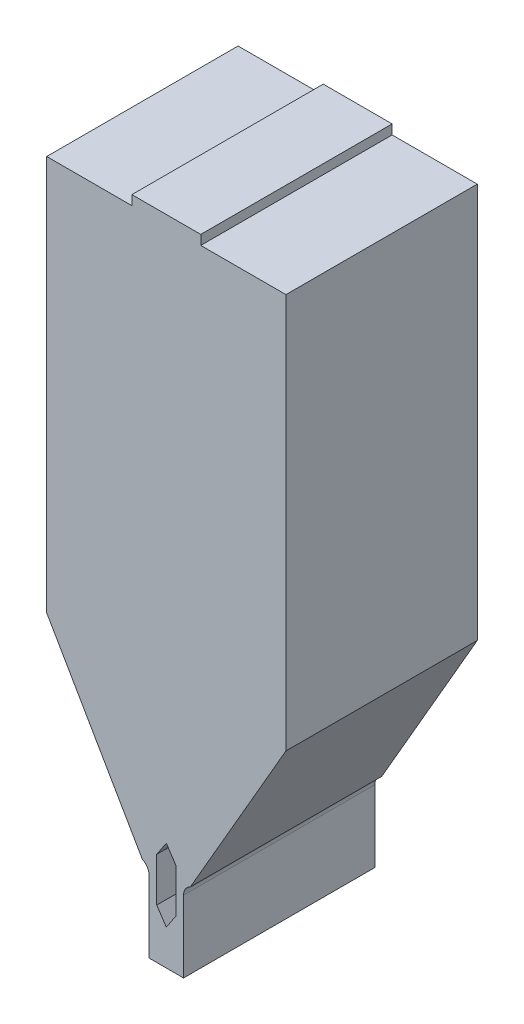
ISO-10303-21;
HEADER;
FILE_DESCRIPTION(('STEP AP214'),'2;1');
FILE_NAME('part.step','',(''),(''),'','','');
FILE_SCHEMA(('AUTOMOTIVE_DESIGN { 1 0 10303 214 1 1 1 1 }'));
ENDSEC;
DATA;
#1=APPLICATION_CONTEXT('core data for automotive mechanical design processes');
#2=APPLICATION_PROTOCOL_DEFINITION('international standard','automotive_design',2000,#1);
#3=PRODUCT_CONTEXT('',#1,'mechanical');
#4=PRODUCT('Part','Part','',(#3));
#5=PRODUCT_RELATED_PRODUCT_CATEGORY('part','',(#4));
#6=PRODUCT_DEFINITION_FORMATION('','',#4);
#7=PRODUCT_DEFINITION_CONTEXT('part definition',#1,'design');
#8=PRODUCT_DEFINITION('design','',#6,#7);
#9=PRODUCT_DEFINITION_SHAPE('','',#8);
#10=(LENGTH_UNIT() NAMED_UNIT(*) SI_UNIT(.MILLI.,.METRE.));
#11=(NAMED_UNIT(*) PLANE_ANGLE_UNIT() SI_UNIT($,.RADIAN.));
#12=(NAMED_UNIT(*) SI_UNIT($,.STERADIAN.) SOLID_ANGLE_UNIT());
#13=UNCERTAINTY_MEASURE_WITH_UNIT(LENGTH_MEASURE(1.E-05),#10,'distance_accuracy_value','');
#14=(GEOMETRIC_REPRESENTATION_CONTEXT(3) GLOBAL_UNCERTAINTY_ASSIGNED_CONTEXT((#13)) GLOBAL_UNIT_ASSIGNED_CONTEXT((#10,
#11,#12)) REPRESENTATION_CONTEXT('',''));
#15=CARTESIAN_POINT('',(0.,0.,0.));
#16=DIRECTION('',(0.,0.,1.));
#17=DIRECTION('',(1.,0.,0.));
#18=AXIS2_PLACEMENT_3D('',#15,#16,#17);
#19=CARTESIAN_POINT('',(125.,597.018363156795,200.));
#20=DIRECTION('',(0.,-1.,0.));
#21=DIRECTION('',(0.,0.,-1.));
#22=AXIS2_PLACEMENT_3D('',#19,#20,#21);
#23=PLANE('',#22);
#24=DIRECTION('',(0.,0.,-1.));
#25=VECTOR('',#24,1.);
#26=CARTESIAN_POINT('',(35.9999999999999,597.018363156795,200.));
#27=LINE('',#26,#25);
#28=CARTESIAN_POINT('',(35.9999999999999,597.018363156795,200.));
#29=VERTEX_POINT('',#28);
#30=CARTESIAN_POINT('',(35.9999999999999,597.018363156795,0.));
#31=VERTEX_POINT('',#30);
#32=EDGE_CURVE('E194',#29,#31,#27,.T.);
#33=ORIENTED_EDGE('',*,*,#32,.F.);
#34=DIRECTION('',(-1.,0.,0.));
#35=VECTOR('',#34,1.);
#36=CARTESIAN_POINT('',(125.,597.018363156795,200.));
#37=LINE('',#36,#35);
#38=CARTESIAN_POINT('',(125.,597.018363156795,200.));
#39=VERTEX_POINT('',#38);
#40=EDGE_CURVE('E215',#39,#29,#37,.T.);
#41=ORIENTED_EDGE('',*,*,#40,.F.);
#42=DIRECTION('',(0.,0.,-1.));
#43=VECTOR('',#42,1.);
#44=CARTESIAN_POINT('',(125.,597.018363156795,200.));
#45=LINE('',#44,#43);
#46=CARTESIAN_POINT('',(125.,597.018363156795,0.));
#47=VERTEX_POINT('',#46);
#48=EDGE_CURVE('E256',#39,#47,#45,.T.);
#49=ORIENTED_EDGE('',*,*,#48,.T.);
#50=DIRECTION('',(-1.,0.,0.));
#51=VECTOR('',#50,1.);
#52=CARTESIAN_POINT('',(125.,597.018363156795,0.));
#53=LINE('',#52,#51);
#54=EDGE_CURVE('E223',#47,#31,#53,.T.);
#55=ORIENTED_EDGE('',*,*,#54,.T.);
#56=EDGE_LOOP('',(#33,#41,#49,#55));
#57=FACE_BOUND('',#56,.T.);
#58=ADVANCED_FACE('F37',(#57),#23,.F.);
#59=CARTESIAN_POINT('',(0.,38.,200.));
#60=DIRECTION('',(0.832050294337844,0.554700196225229,0.));
#61=DIRECTION('',(-0.554700196225229,0.832050294337844,0.));
#62=AXIS2_PLACEMENT_3D('',#59,#60,#61);
#63=PLANE('',#62);
#64=CARTESIAN_POINT('',(0.,38.,100.));
#65=DIRECTION('',(0.832050294337844,0.554700196225229,0.));
#66=DIRECTION('',(0.554700196225229,-0.832050294337844,0.));
#67=AXIS2_PLACEMENT_3D('',#64,#65,#66);
#68=ELLIPSE('',#67,13.52081728299,7.50000000000001);
#69=CARTESIAN_POINT('',(0.,38.,92.5));
#70=VERTEX_POINT('',#69);
#71=CARTESIAN_POINT('',(0.,38.,107.5));
#72=VERTEX_POINT('',#71);
#73=EDGE_CURVE('E11',#70,#72,#68,.F.);
#74=ORIENTED_EDGE('',*,*,#73,.F.);
#75=DIRECTION('',(0.,0.,-1.));
#76=VECTOR('',#75,1.);
#77=CARTESIAN_POINT('',(0.,38.,200.));
#78=LINE('',#77,#76);
#79=CARTESIAN_POINT('',(0.,38.,0.));
#80=VERTEX_POINT('',#79);
#81=EDGE_CURVE('E277',#70,#80,#78,.T.);
#82=ORIENTED_EDGE('',*,*,#81,.T.);
#83=DIRECTION('',(0.554700196225229,-0.832050294337844,0.));
#84=VECTOR('',#83,1.);
#85=CARTESIAN_POINT('',(0.,38.,0.));
#86=LINE('',#85,#84);
#87=CARTESIAN_POINT('',(10.,23.,0.));
#88=VERTEX_POINT('',#87);
#89=EDGE_CURVE('E228',#80,#88,#86,.T.);
#90=ORIENTED_EDGE('',*,*,#89,.T.);
#91=DIRECTION('',(0.,0.,-1.));
#92=VECTOR('',#91,1.);
#93=CARTESIAN_POINT('',(10.,23.,200.));
#94=LINE('',#93,#92);
#95=CARTESIAN_POINT('',(10.,23.,200.));
#96=VERTEX_POINT('',#95);
#97=EDGE_CURVE('E275',#96,#88,#94,.T.);
#98=ORIENTED_EDGE('',*,*,#97,.F.);
#99=DIRECTION('',(0.554700196225229,-0.832050294337844,0.));
#100=VECTOR('',#99,1.);
#101=CARTESIAN_POINT('',(0.,38.,200.));
#102=LINE('',#101,#100);
#103=CARTESIAN_POINT('',(0.,38.,200.));
#104=VERTEX_POINT('',#103);
#105=EDGE_CURVE('E289',#104,#96,#102,.T.);
#106=ORIENTED_EDGE('',*,*,#105,.F.);
#107=EDGE_CURVE('E44',#104,#72,#78,.T.);
#108=ORIENTED_EDGE('',*,*,#107,.T.);
#109=EDGE_LOOP('',(#74,#82,#90,#98,#106,#108));
#110=FACE_BOUND('',#109,.T.);
#111=ADVANCED_FACE('F288',(#110),#63,.F.);
#112=CARTESIAN_POINT('',(10.,-23.,200.));
#113=DIRECTION('',(1.,0.,0.));
#114=DIRECTION('',(0.,1.,0.));
#115=AXIS2_PLACEMENT_3D('',#112,#113,#114);
#116=PLANE('',#115);
#117=DIRECTION('',(0.,-1.,0.));
#118=VECTOR('',#117,1.);
#119=CARTESIAN_POINT('',(10.,-23.,0.));
#120=LINE('',#119,#118);
#121=CARTESIAN_POINT('',(10.,-23.,0.));
#122=VERTEX_POINT('',#121);
#123=EDGE_CURVE('E233',#88,#122,#120,.T.);
#124=ORIENTED_EDGE('',*,*,#123,.T.);
#125=DIRECTION('',(0.,0.,-1.));
#126=VECTOR('',#125,1.);
#127=CARTESIAN_POINT('',(10.,-23.,200.));
#128=LINE('',#127,#126);
#129=CARTESIAN_POINT('',(10.,-23.,200.));
#130=VERTEX_POINT('',#129);
#131=EDGE_CURVE('E273',#130,#122,#128,.T.);
#132=ORIENTED_EDGE('',*,*,#131,.F.);
#133=DIRECTION('',(0.,-1.,0.));
#134=VECTOR('',#133,1.);
#135=CARTESIAN_POINT('',(10.,23.,200.));
#136=LINE('',#135,#134);
#137=EDGE_CURVE('E384',#96,#130,#136,.T.);
#138=ORIENTED_EDGE('',*,*,#137,.F.);
#139=ORIENTED_EDGE('',*,*,#97,.T.);
#140=EDGE_LOOP('',(#124,#132,#138,#139));
#141=FACE_BOUND('',#140,.T.);
#142=ADVANCED_FACE('F385',(#141),#116,.F.);
#143=CARTESIAN_POINT('',(0.,-38.,200.));
#144=DIRECTION('',(0.832050294337844,-0.554700196225229,0.));
#145=DIRECTION('',(0.554700196225229,0.832050294337844,0.));
#146=AXIS2_PLACEMENT_3D('',#143,#144,#145);
#147=PLANE('',#146);
#148=DIRECTION('',(-0.554700196225229,-0.832050294337843,0.));
#149=VECTOR('',#148,1.);
#150=CARTESIAN_POINT('',(0.,-38.,0.));
#151=LINE('',#150,#149);
#152=CARTESIAN_POINT('',(0.,-38.,0.));
#153=VERTEX_POINT('',#152);
#154=EDGE_CURVE('E244',#122,#153,#151,.T.);
#155=ORIENTED_EDGE('',*,*,#154,.T.);
#156=DIRECTION('',(0.,0.,-1.));
#157=VECTOR('',#156,1.);
#158=CARTESIAN_POINT('',(0.,-38.,200.));
#159=LINE('',#158,#157);
#160=CARTESIAN_POINT('',(0.,-38.,200.));
#161=VERTEX_POINT('',#160);
#162=EDGE_CURVE('E270',#161,#153,#159,.T.);
#163=ORIENTED_EDGE('',*,*,#162,.F.);
#164=DIRECTION('',(-0.554700196225229,-0.832050294337843,0.));
#165=VECTOR('',#164,1.);
#166=CARTESIAN_POINT('',(0.,-38.,200.));
#167=LINE('',#166,#165);
#168=EDGE_CURVE('E378',#130,#161,#167,.T.);
#169=ORIENTED_EDGE('',*,*,#168,.F.);
#170=ORIENTED_EDGE('',*,*,#131,.T.);
#171=EDGE_LOOP('',(#155,#163,#169,#170));
#172=FACE_BOUND('',#171,.T.);
#173=ADVANCED_FACE('F435',(#172),#147,.F.);
#174=CARTESIAN_POINT('',(18.,-75.,200.));
#175=DIRECTION('',(0.,1.,0.));
#176=DIRECTION('',(0.,0.,1.));
#177=AXIS2_PLACEMENT_3D('',#174,#175,#176);
#178=PLANE('',#177);
#179=DIRECTION('',(1.,0.,0.));
#180=VECTOR('',#179,1.);
#181=CARTESIAN_POINT('',(18.,-75.,0.));
#182=LINE('',#181,#180);
#183=CARTESIAN_POINT('',(-18.,-75.,0.));
#184=VERTEX_POINT('',#183);
#185=CARTESIAN_POINT('',(18.,-75.,0.));
#186=VERTEX_POINT('',#185);
#187=EDGE_CURVE('E246',#184,#186,#182,.T.);
#188=ORIENTED_EDGE('',*,*,#187,.T.);
#189=DIRECTION('',(0.,0.,-1.));
#190=VECTOR('',#189,1.);
#191=CARTESIAN_POINT('',(18.,-75.,200.));
#192=LINE('',#191,#190);
#193=CARTESIAN_POINT('',(18.,-75.,200.));
#194=VERTEX_POINT('',#193);
#195=EDGE_CURVE('E267',#194,#186,#192,.T.);
#196=ORIENTED_EDGE('',*,*,#195,.F.);
#197=DIRECTION('',(1.,0.,0.));
#198=VECTOR('',#197,1.);
#199=CARTESIAN_POINT('',(18.,-75.,200.));
#200=LINE('',#199,#198);
#201=CARTESIAN_POINT('',(-18.,-75.,200.));
#202=VERTEX_POINT('',#201);
#203=EDGE_CURVE('E387',#202,#194,#200,.T.);
#204=ORIENTED_EDGE('',*,*,#203,.F.);
#205=DIRECTION('',(0.,0.,-1.));
#206=VECTOR('',#205,1.);
#207=CARTESIAN_POINT('',(-18.,-75.,200.));
#208=LINE('',#207,#206);
#209=EDGE_CURVE('E335',#202,#184,#208,.T.);
#210=ORIENTED_EDGE('',*,*,#209,.T.);
#211=EDGE_LOOP('',(#188,#196,#204,#210));
#212=FACE_BOUND('',#211,.T.);
#213=ADVANCED_FACE('F440',(#212),#178,.F.);
#214=CARTESIAN_POINT('',(18.,0.,200.));
#215=DIRECTION('',(-1.,0.,0.));
#216=DIRECTION('',(0.,0.,1.));
#217=AXIS2_PLACEMENT_3D('',#214,#215,#216);
#218=PLANE('',#217);
#219=DIRECTION('',(0.,1.,0.));
#220=VECTOR('',#219,1.);
#221=CARTESIAN_POINT('',(18.,0.,0.));
#222=LINE('',#221,#220);
#223=CARTESIAN_POINT('',(18.,0.,0.));
#224=VERTEX_POINT('',#223);
#225=EDGE_CURVE('E248',#186,#224,#222,.T.);
#226=ORIENTED_EDGE('',*,*,#225,.T.);
#227=DIRECTION('',(0.,0.,-1.));
#228=VECTOR('',#227,1.);
#229=CARTESIAN_POINT('',(18.,0.,200.));
#230=LINE('',#229,#228);
#231=CARTESIAN_POINT('',(18.,0.,200.));
#232=VERTEX_POINT('',#231);
#233=EDGE_CURVE('E264',#232,#224,#230,.T.);
#234=ORIENTED_EDGE('',*,*,#233,.F.);
#235=DIRECTION('',(0.,1.,0.));
#236=VECTOR('',#235,1.);
#237=CARTESIAN_POINT('',(18.,0.,200.));
#238=LINE('',#237,#236);
#239=EDGE_CURVE('E391',#194,#232,#238,.T.);
#240=ORIENTED_EDGE('',*,*,#239,.F.);
#241=ORIENTED_EDGE('',*,*,#195,.T.);
#242=EDGE_LOOP('',(#226,#234,#240,#241));
#243=FACE_BOUND('',#242,.T.);
#244=ADVANCED_FACE('F444',(#243),#218,.F.);
#245=CARTESIAN_POINT('',(30.,0.,200.));
#246=DIRECTION('',(0.,0.,-1.));
#247=DIRECTION('',(-1.,0.,0.));
#248=AXIS2_PLACEMENT_3D('',#245,#246,#247);
#249=CYLINDRICAL_SURFACE('',#248,12.);
#250=CARTESIAN_POINT('',(30.,0.,0.));
#251=DIRECTION('',(0.,0.,-1.));
#252=DIRECTION('',(-1.,0.,0.));
#253=AXIS2_PLACEMENT_3D('',#250,#251,#252);
#254=CIRCLE('',#253,12.);
#255=CARTESIAN_POINT('',(25.1,10.9539947051293,0.));
#256=VERTEX_POINT('',#255);
#257=EDGE_CURVE('E250',#224,#256,#254,.T.);
#258=ORIENTED_EDGE('',*,*,#257,.T.);
#259=DIRECTION('',(0.,0.,-1.));
#260=VECTOR('',#259,1.);
#261=CARTESIAN_POINT('',(25.1,10.9539947051293,200.));
#262=LINE('',#261,#260);
#263=CARTESIAN_POINT('',(25.1,10.9539947051293,200.));
#264=VERTEX_POINT('',#263);
#265=EDGE_CURVE('E261',#264,#256,#262,.T.);
#266=ORIENTED_EDGE('',*,*,#265,.F.);
#267=CARTESIAN_POINT('',(30.,0.,200.));
#268=DIRECTION('',(0.,0.,-1.));
#269=DIRECTION('',(-1.,0.,0.));
#270=AXIS2_PLACEMENT_3D('',#267,#268,#269);
#271=CIRCLE('',#270,12.);
#272=EDGE_CURVE('E393',#232,#264,#271,.T.);
#273=ORIENTED_EDGE('',*,*,#272,.F.);
#274=ORIENTED_EDGE('',*,*,#233,.T.);
#275=EDGE_LOOP('',(#258,#266,#273,#274));
#276=FACE_BOUND('',#275,.T.);
#277=ADVANCED_FACE('F448',(#276),#249,.F.);
#278=CARTESIAN_POINT('',(25.1,10.9539947051293,200.));
#279=DIRECTION('',(-0.866025403784442,0.499999999999995,0.));
#280=DIRECTION('',(-0.499999999999995,-0.866025403784442,0.));
#281=AXIS2_PLACEMENT_3D('',#278,#279,#280);
#282=PLANE('',#281);
#283=DIRECTION('',(0.499999999999995,0.866025403784442,0.));
#284=VECTOR('',#283,1.);
#285=CARTESIAN_POINT('',(25.1,10.9539947051293,0.));
#286=LINE('',#285,#284);
#287=CARTESIAN_POINT('',(125.,183.985870381263,0.));
#288=VERTEX_POINT('',#287);
#289=EDGE_CURVE('E252',#256,#288,#286,.T.);
#290=ORIENTED_EDGE('',*,*,#289,.T.);
#291=DIRECTION('',(0.,0.,-1.));
#292=VECTOR('',#291,1.);
#293=CARTESIAN_POINT('',(125.,183.985870381263,200.));
#294=LINE('',#293,#292);
#295=CARTESIAN_POINT('',(125.,183.985870381263,200.));
#296=VERTEX_POINT('',#295);
#297=EDGE_CURVE('E258',#296,#288,#294,.T.);
#298=ORIENTED_EDGE('',*,*,#297,.F.);
#299=DIRECTION('',(0.499999999999995,0.866025403784442,0.));
#300=VECTOR('',#299,1.);
#301=CARTESIAN_POINT('',(25.1,10.9539947051293,200.));
#302=LINE('',#301,#300);
#303=EDGE_CURVE('E394',#264,#296,#302,.T.);
#304=ORIENTED_EDGE('',*,*,#303,.F.);
#305=ORIENTED_EDGE('',*,*,#265,.T.);
#306=EDGE_LOOP('',(#290,#298,#304,#305));
#307=FACE_BOUND('',#306,.T.);
#308=ADVANCED_FACE('F452',(#307),#282,.F.);
#309=CARTESIAN_POINT('',(125.,183.985870381263,200.));
#310=DIRECTION('',(-1.,0.,0.));
#311=DIRECTION('',(0.,0.,1.));
#312=AXIS2_PLACEMENT_3D('',#309,#310,#311);
#313=PLANE('',#312);
#314=DIRECTION('',(0.,1.,0.));
#315=VECTOR('',#314,1.);
#316=CARTESIAN_POINT('',(125.,183.985870381263,0.));
#317=LINE('',#316,#315);
#318=EDGE_CURVE('E254',#288,#47,#317,.T.);
#319=ORIENTED_EDGE('',*,*,#318,.T.);
#320=ORIENTED_EDGE('',*,*,#48,.F.);
#321=DIRECTION('',(0.,1.,0.));
#322=VECTOR('',#321,1.);
#323=CARTESIAN_POINT('',(125.,183.985870381263,200.));
#324=LINE('',#323,#322);
#325=EDGE_CURVE('E240',#296,#39,#324,.T.);
#326=ORIENTED_EDGE('',*,*,#325,.F.);
#327=ORIENTED_EDGE('',*,*,#297,.T.);
#328=EDGE_LOOP('',(#319,#320,#326,#327));
#329=FACE_BOUND('',#328,.T.);
#330=ADVANCED_FACE('F402',(#329),#313,.F.);
#331=CARTESIAN_POINT('',(30.,0.,200.));
#332=DIRECTION('',(0.,0.,-1.));
#333=DIRECTION('',(-1.,0.,0.));
#334=AXIS2_PLACEMENT_3D('',#331,#332,#333);
#335=PLANE('',#334);
#336=DIRECTION('',(0.,1.,0.));
#337=VECTOR('',#336,1.);
#338=CARTESIAN_POINT('',(-18.,0.,200.));
#339=LINE('',#338,#337);
#340=CARTESIAN_POINT('',(-18.,0.,200.));
#341=VERTEX_POINT('',#340);
#342=EDGE_CURVE('E367',#202,#341,#339,.T.);
#343=ORIENTED_EDGE('',*,*,#342,.F.);
#344=ORIENTED_EDGE('',*,*,#203,.T.);
#345=ORIENTED_EDGE('',*,*,#239,.T.);
#346=ORIENTED_EDGE('',*,*,#272,.T.);
#347=ORIENTED_EDGE('',*,*,#303,.T.);
#348=ORIENTED_EDGE('',*,*,#325,.T.);
#349=ORIENTED_EDGE('',*,*,#40,.T.);
#350=DIRECTION('',(0.,-1.,0.));
#351=VECTOR('',#350,1.);
#352=CARTESIAN_POINT('',(35.9999999999999,607.018363156795,200.));
#353=LINE('',#352,#351);
#354=CARTESIAN_POINT('',(35.9999999999999,607.018363156795,200.));
#355=VERTEX_POINT('',#354);
#356=EDGE_CURVE('E219',#355,#29,#353,.T.);
#357=ORIENTED_EDGE('',*,*,#356,.F.);
#358=DIRECTION('',(1.,0.,0.));
#359=VECTOR('',#358,1.);
#360=CARTESIAN_POINT('',(-1.42227759985557E-13,607.018363156795,200.));
#361=LINE('',#360,#359);
#362=CARTESIAN_POINT('',(-35.9999999999999,607.018363156795,200.));
#363=VERTEX_POINT('',#362);
#364=EDGE_CURVE('E200',#363,#355,#361,.T.);
#365=ORIENTED_EDGE('',*,*,#364,.F.);
#366=DIRECTION('',(0.,-1.,0.));
#367=VECTOR('',#366,1.);
#368=CARTESIAN_POINT('',(-35.9999999999999,607.018363156795,200.));
#369=LINE('',#368,#367);
#370=CARTESIAN_POINT('',(-35.9999999999999,597.018363156795,200.));
#371=VERTEX_POINT('',#370);
#372=EDGE_CURVE('E414',#363,#371,#369,.T.);
#373=ORIENTED_EDGE('',*,*,#372,.T.);
#374=DIRECTION('',(1.,0.,0.));
#375=VECTOR('',#374,1.);
#376=CARTESIAN_POINT('',(-125.,597.018363156795,200.));
#377=LINE('',#376,#375);
#378=CARTESIAN_POINT('',(-125.,597.018363156795,200.));
#379=VERTEX_POINT('',#378);
#380=EDGE_CURVE('E51',#379,#371,#377,.T.);
#381=ORIENTED_EDGE('',*,*,#380,.F.);
#382=DIRECTION('',(0.,1.,0.));
#383=VECTOR('',#382,1.);
#384=CARTESIAN_POINT('',(-125.,183.985870381263,200.));
#385=LINE('',#384,#383);
#386=CARTESIAN_POINT('',(-125.,183.985870381263,200.));
#387=VERTEX_POINT('',#386);
#388=EDGE_CURVE('E365',#387,#379,#385,.T.);
#389=ORIENTED_EDGE('',*,*,#388,.F.);
#390=DIRECTION('',(-0.499999999999995,0.866025403784442,0.));
#391=VECTOR('',#390,1.);
#392=CARTESIAN_POINT('',(-25.1,10.9539947051293,200.));
#393=LINE('',#392,#391);
#394=CARTESIAN_POINT('',(-25.1,10.9539947051293,200.));
#395=VERTEX_POINT('',#394);
#396=EDGE_CURVE('E347',#395,#387,#393,.T.);
#397=ORIENTED_EDGE('',*,*,#396,.F.);
#398=CARTESIAN_POINT('',(-30.,0.,200.));
#399=DIRECTION('',(0.,0.,1.));
#400=DIRECTION('',(1.,0.,0.));
#401=AXIS2_PLACEMENT_3D('',#398,#399,#400);
#402=CIRCLE('',#401,12.);
#403=EDGE_CURVE('E361',#341,#395,#402,.T.);
#404=ORIENTED_EDGE('',*,*,#403,.F.);
#405=EDGE_LOOP('',(#343,#344,#345,#346,#347,#348,#349,#357,#365,#373,#381,#389,#397,#404));
#406=FACE_BOUND('',#405,.T.);
#407=ORIENTED_EDGE('',*,*,#168,.T.);
#408=DIRECTION('',(0.554700196225229,-0.832050294337843,0.));
#409=VECTOR('',#408,1.);
#410=CARTESIAN_POINT('',(0.,-38.,200.));
#411=LINE('',#410,#409);
#412=CARTESIAN_POINT('',(-10.,-23.,200.));
#413=VERTEX_POINT('',#412);
#414=EDGE_CURVE('E306',#413,#161,#411,.T.);
#415=ORIENTED_EDGE('',*,*,#414,.F.);
#416=DIRECTION('',(0.,-1.,0.));
#417=VECTOR('',#416,1.);
#418=CARTESIAN_POINT('',(-10.,-23.,200.));
#419=LINE('',#418,#417);
#420=CARTESIAN_POINT('',(-10.,23.,200.));
#421=VERTEX_POINT('',#420);
#422=EDGE_CURVE('E300',#421,#413,#419,.T.);
#423=ORIENTED_EDGE('',*,*,#422,.F.);
#424=DIRECTION('',(-0.554700196225229,-0.832050294337844,0.));
#425=VECTOR('',#424,1.);
#426=CARTESIAN_POINT('',(0.,38.,200.));
#427=LINE('',#426,#425);
#428=EDGE_CURVE('E294',#104,#421,#427,.T.);
#429=ORIENTED_EDGE('',*,*,#428,.F.);
#430=ORIENTED_EDGE('',*,*,#105,.T.);
#431=ORIENTED_EDGE('',*,*,#137,.T.);
#432=EDGE_LOOP('',(#407,#415,#423,#429,#430,#431));
#433=FACE_BOUND('',#432,.T.);
#434=ADVANCED_FACE('F297',(#406,#433),#335,.F.);
#435=CARTESIAN_POINT('',(30.,0.,0.));
#436=DIRECTION('',(0.,0.,-1.));
#437=DIRECTION('',(-1.,0.,0.));
#438=AXIS2_PLACEMENT_3D('',#435,#436,#437);
#439=PLANE('',#438);
#440=ORIENTED_EDGE('',*,*,#187,.F.);
#441=DIRECTION('',(0.,1.,0.));
#442=VECTOR('',#441,1.);
#443=CARTESIAN_POINT('',(-18.,0.,0.));
#444=LINE('',#443,#442);
#445=CARTESIAN_POINT('',(-18.,0.,0.));
#446=VERTEX_POINT('',#445);
#447=EDGE_CURVE('E322',#184,#446,#444,.T.);
#448=ORIENTED_EDGE('',*,*,#447,.T.);
#449=CARTESIAN_POINT('',(-30.,0.,0.));
#450=DIRECTION('',(0.,0.,1.));
#451=DIRECTION('',(1.,0.,0.));
#452=AXIS2_PLACEMENT_3D('',#449,#450,#451);
#453=CIRCLE('',#452,12.);
#454=CARTESIAN_POINT('',(-25.1,10.9539947051293,0.));
#455=VERTEX_POINT('',#454);
#456=EDGE_CURVE('E319',#446,#455,#453,.T.);
#457=ORIENTED_EDGE('',*,*,#456,.T.);
#458=DIRECTION('',(-0.499999999999995,0.866025403784442,0.));
#459=VECTOR('',#458,1.);
#460=CARTESIAN_POINT('',(-25.1,10.9539947051293,0.));
#461=LINE('',#460,#459);
#462=CARTESIAN_POINT('',(-125.,183.985870381263,0.));
#463=VERTEX_POINT('',#462);
#464=EDGE_CURVE('E316',#455,#463,#461,.T.);
#465=ORIENTED_EDGE('',*,*,#464,.T.);
#466=DIRECTION('',(0.,1.,0.));
#467=VECTOR('',#466,1.);
#468=CARTESIAN_POINT('',(-125.,183.985870381263,0.));
#469=LINE('',#468,#467);
#470=CARTESIAN_POINT('',(-125.,597.018363156795,0.));
#471=VERTEX_POINT('',#470);
#472=EDGE_CURVE('E312',#463,#471,#469,.T.);
#473=ORIENTED_EDGE('',*,*,#472,.T.);
#474=DIRECTION('',(1.,0.,0.));
#475=VECTOR('',#474,1.);
#476=CARTESIAN_POINT('',(-125.,597.018363156795,0.));
#477=LINE('',#476,#475);
#478=CARTESIAN_POINT('',(-35.9999999999999,597.018363156795,0.));
#479=VERTEX_POINT('',#478);
#480=EDGE_CURVE('E310',#471,#479,#477,.T.);
#481=ORIENTED_EDGE('',*,*,#480,.T.);
#482=DIRECTION('',(0.,-1.,0.));
#483=VECTOR('',#482,1.);
#484=CARTESIAN_POINT('',(-35.9999999999999,607.018363156795,0.));
#485=LINE('',#484,#483);
#486=CARTESIAN_POINT('',(-35.9999999999999,607.018363156795,0.));
#487=VERTEX_POINT('',#486);
#488=EDGE_CURVE('E313',#487,#479,#485,.T.);
#489=ORIENTED_EDGE('',*,*,#488,.F.);
#490=DIRECTION('',(-1.,0.,0.));
#491=VECTOR('',#490,1.);
#492=CARTESIAN_POINT('',(0.,607.018363156795,0.));
#493=LINE('',#492,#491);
#494=CARTESIAN_POINT('',(35.9999999999999,607.018363156795,0.));
#495=VERTEX_POINT('',#494);
#496=EDGE_CURVE('E204',#495,#487,#493,.T.);
#497=ORIENTED_EDGE('',*,*,#496,.F.);
#498=DIRECTION('',(0.,-1.,0.));
#499=VECTOR('',#498,1.);
#500=CARTESIAN_POINT('',(35.9999999999999,607.018363156795,0.));
#501=LINE('',#500,#499);
#502=EDGE_CURVE('E206',#495,#31,#501,.T.);
#503=ORIENTED_EDGE('',*,*,#502,.T.);
#504=ORIENTED_EDGE('',*,*,#54,.F.);
#505=ORIENTED_EDGE('',*,*,#318,.F.);
#506=ORIENTED_EDGE('',*,*,#289,.F.);
#507=ORIENTED_EDGE('',*,*,#257,.F.);
#508=ORIENTED_EDGE('',*,*,#225,.F.);
#509=EDGE_LOOP('',(#440,#448,#457,#465,#473,#481,#489,#497,#503,#504,#505,#506,#507,#508));
#510=FACE_BOUND('',#509,.T.);
#511=DIRECTION('',(0.554700196225229,-0.832050294337843,0.));
#512=VECTOR('',#511,1.);
#513=CARTESIAN_POINT('',(0.,-38.,0.));
#514=LINE('',#513,#512);
#515=CARTESIAN_POINT('',(-10.,-23.,0.));
#516=VERTEX_POINT('',#515);
#517=EDGE_CURVE('E325',#516,#153,#514,.T.);
#518=ORIENTED_EDGE('',*,*,#517,.T.);
#519=ORIENTED_EDGE('',*,*,#154,.F.);
#520=ORIENTED_EDGE('',*,*,#123,.F.);
#521=ORIENTED_EDGE('',*,*,#89,.F.);
#522=DIRECTION('',(-0.554700196225229,-0.832050294337844,0.));
#523=VECTOR('',#522,1.);
#524=CARTESIAN_POINT('',(0.,38.,0.));
#525=LINE('',#524,#523);
#526=CARTESIAN_POINT('',(-10.,23.,0.));
#527=VERTEX_POINT('',#526);
#528=EDGE_CURVE('E330',#80,#527,#525,.T.);
#529=ORIENTED_EDGE('',*,*,#528,.T.);
#530=DIRECTION('',(0.,-1.,0.));
#531=VECTOR('',#530,1.);
#532=CARTESIAN_POINT('',(-10.,23.,0.));
#533=LINE('',#532,#531);
#534=EDGE_CURVE('E328',#527,#516,#533,.T.);
#535=ORIENTED_EDGE('',*,*,#534,.T.);
#536=EDGE_LOOP('',(#518,#519,#520,#521,#529,#535));
#537=FACE_BOUND('',#536,.T.);
#538=ADVANCED_FACE('F353',(#510,#537),#439,.T.);
#539=CARTESIAN_POINT('',(35.9999999999999,607.018363156795,200.));
#540=DIRECTION('',(-1.,0.,0.));
#541=DIRECTION('',(0.,0.,1.));
#542=AXIS2_PLACEMENT_3D('',#539,#540,#541);
#543=PLANE('',#542);
#544=ORIENTED_EDGE('',*,*,#32,.T.);
#545=ORIENTED_EDGE('',*,*,#502,.F.);
#546=DIRECTION('',(0.,0.,-1.));
#547=VECTOR('',#546,1.);
#548=CARTESIAN_POINT('',(35.9999999999999,607.018363156795,200.));
#549=LINE('',#548,#547);
#550=EDGE_CURVE('E202',#355,#495,#549,.T.);
#551=ORIENTED_EDGE('',*,*,#550,.F.);
#552=ORIENTED_EDGE('',*,*,#356,.T.);
#553=EDGE_LOOP('',(#544,#545,#551,#552));
#554=FACE_BOUND('',#553,.T.);
#555=ADVANCED_FACE('F405',(#554),#543,.F.);
#556=CARTESIAN_POINT('',(0.,607.018363156795,0.));
#557=DIRECTION('',(0.,-1.,0.));
#558=DIRECTION('',(0.,0.,-1.));
#559=AXIS2_PLACEMENT_3D('',#556,#557,#558);
#560=PLANE('',#559);
#561=ORIENTED_EDGE('',*,*,#496,.T.);
#562=DIRECTION('',(0.,0.,-1.));
#563=VECTOR('',#562,1.);
#564=CARTESIAN_POINT('',(-35.9999999999999,607.018363156795,200.));
#565=LINE('',#564,#563);
#566=EDGE_CURVE('E412',#363,#487,#565,.T.);
#567=ORIENTED_EDGE('',*,*,#566,.F.);
#568=ORIENTED_EDGE('',*,*,#364,.T.);
#569=ORIENTED_EDGE('',*,*,#550,.T.);
#570=EDGE_LOOP('',(#561,#567,#568,#569));
#571=FACE_BOUND('',#570,.T.);
#572=ADVANCED_FACE('F184',(#571),#560,.F.);
#573=CARTESIAN_POINT('',(0.,74.8867513459482,100.));
#574=DIRECTION('',(0.,-1.,0.));
#575=DIRECTION('',(0.,0.,-1.));
#576=AXIS2_PLACEMENT_3D('',#573,#574,#575);
#577=CONICAL_SURFACE('',#576,0.,1.04719755119659);
#578=CARTESIAN_POINT('',(0.,74.8867513459482,100.));
#579=VERTEX_POINT('',#578);
#580=VERTEX_LOOP('',#579);
#581=FACE_BOUND('',#580,.T.);
#582=CARTESIAN_POINT('',(0.,72.,100.));
#583=DIRECTION('',(0.,-1.,0.));
#584=DIRECTION('',(0.,0.,-1.));
#585=AXIS2_PLACEMENT_3D('',#582,#583,#584);
#586=CIRCLE('',#585,5.);
#587=CARTESIAN_POINT('',(0.,72.,95.));
#588=VERTEX_POINT('',#587);
#589=EDGE_CURVE('E188',#588,#588,#586,.T.);
#590=ORIENTED_EDGE('',*,*,#589,.T.);
#591=EDGE_LOOP('',(#590));
#592=FACE_BOUND('',#591,.T.);
#593=ADVANCED_FACE('F180',(#581,#592),#577,.F.);
#594=CARTESIAN_POINT('',(0.,72.,100.));
#595=DIRECTION('',(0.,-1.,0.));
#596=DIRECTION('',(0.,0.,-1.));
#597=AXIS2_PLACEMENT_3D('',#594,#595,#596);
#598=CONICAL_SURFACE('',#597,5.,0.785398163397448);
#599=ORIENTED_EDGE('',*,*,#589,.F.);
#600=EDGE_LOOP('',(#599));
#601=FACE_BOUND('',#600,.T.);
#602=CARTESIAN_POINT('',(0.,69.5,100.));
#603=DIRECTION('',(0.,-1.,0.));
#604=DIRECTION('',(0.,0.,-1.));
#605=AXIS2_PLACEMENT_3D('',#602,#603,#604);
#606=CIRCLE('',#605,7.50000000000001);
#607=CARTESIAN_POINT('',(0.,69.5,92.5));
#608=VERTEX_POINT('',#607);
#609=EDGE_CURVE('E190',#608,#608,#606,.T.);
#610=ORIENTED_EDGE('',*,*,#609,.T.);
#611=EDGE_LOOP('',(#610));
#612=FACE_BOUND('',#611,.T.);
#613=ADVANCED_FACE('F183',(#601,#612),#598,.F.);
#614=CARTESIAN_POINT('',(0.,0.,100.));
#615=DIRECTION('',(0.,-1.,0.));
#616=DIRECTION('',(0.,0.,-1.));
#617=AXIS2_PLACEMENT_3D('',#614,#615,#616);
#618=CYLINDRICAL_SURFACE('',#617,7.50000000000001);
#619=ORIENTED_EDGE('',*,*,#609,.F.);
#620=EDGE_LOOP('',(#619));
#621=FACE_BOUND('',#620,.T.);
#622=ORIENTED_EDGE('',*,*,#73,.T.);
#623=CARTESIAN_POINT('',(0.,38.,100.));
#624=DIRECTION('',(0.832050294337844,-0.554700196225229,0.));
#625=DIRECTION('',(-0.554700196225229,-0.832050294337844,0.));
#626=AXIS2_PLACEMENT_3D('',#623,#624,#625);
#627=ELLIPSE('',#626,13.52081728299,7.50000000000001);
#628=EDGE_CURVE('E295',#70,#72,#627,.F.);
#629=ORIENTED_EDGE('',*,*,#628,.F.);
#630=EDGE_LOOP('',(#622,#629));
#631=FACE_BOUND('',#630,.T.);
#632=ADVANCED_FACE('F467',(#621,#631),#618,.F.);
#633=CARTESIAN_POINT('',(-125.,597.018363156795,200.));
#634=DIRECTION('',(0.,1.,0.));
#635=DIRECTION('',(0.,0.,1.));
#636=AXIS2_PLACEMENT_3D('',#633,#634,#635);
#637=PLANE('',#636);
#638=DIRECTION('',(0.,0.,-1.));
#639=VECTOR('',#638,1.);
#640=CARTESIAN_POINT('',(-35.9999999999999,597.018363156795,200.));
#641=LINE('',#640,#639);
#642=EDGE_CURVE('E56',#371,#479,#641,.T.);
#643=ORIENTED_EDGE('',*,*,#642,.T.);
#644=ORIENTED_EDGE('',*,*,#480,.F.);
#645=DIRECTION('',(0.,0.,-1.));
#646=VECTOR('',#645,1.);
#647=CARTESIAN_POINT('',(-125.,597.018363156795,200.));
#648=LINE('',#647,#646);
#649=EDGE_CURVE('E191',#379,#471,#648,.T.);
#650=ORIENTED_EDGE('',*,*,#649,.F.);
#651=ORIENTED_EDGE('',*,*,#380,.T.);
#652=EDGE_LOOP('',(#643,#644,#650,#651));
#653=FACE_BOUND('',#652,.T.);
#654=ADVANCED_FACE('F470',(#653),#637,.T.);
#655=CARTESIAN_POINT('',(-125.,183.985870381263,200.));
#656=DIRECTION('',(-1.,0.,0.));
#657=DIRECTION('',(0.,0.,1.));
#658=AXIS2_PLACEMENT_3D('',#655,#656,#657);
#659=PLANE('',#658);
#660=ORIENTED_EDGE('',*,*,#472,.F.);
#661=DIRECTION('',(0.,0.,-1.));
#662=VECTOR('',#661,1.);
#663=CARTESIAN_POINT('',(-125.,183.985870381263,200.));
#664=LINE('',#663,#662);
#665=EDGE_CURVE('E196',#387,#463,#664,.T.);
#666=ORIENTED_EDGE('',*,*,#665,.F.);
#667=ORIENTED_EDGE('',*,*,#388,.T.);
#668=ORIENTED_EDGE('',*,*,#649,.T.);
#669=EDGE_LOOP('',(#660,#666,#667,#668));
#670=FACE_BOUND('',#669,.T.);
#671=ADVANCED_FACE('F351',(#670),#659,.T.);
#672=CARTESIAN_POINT('',(-25.1,10.9539947051293,200.));
#673=DIRECTION('',(-0.866025403784442,-0.499999999999995,0.));
#674=DIRECTION('',(0.499999999999995,-0.866025403784442,0.));
#675=AXIS2_PLACEMENT_3D('',#672,#673,#674);
#676=PLANE('',#675);
#677=ORIENTED_EDGE('',*,*,#464,.F.);
#678=DIRECTION('',(0.,0.,-1.));
#679=VECTOR('',#678,1.);
#680=CARTESIAN_POINT('',(-25.1,10.9539947051293,200.));
#681=LINE('',#680,#679);
#682=EDGE_CURVE('E340',#395,#455,#681,.T.);
#683=ORIENTED_EDGE('',*,*,#682,.F.);
#684=ORIENTED_EDGE('',*,*,#396,.T.);
#685=ORIENTED_EDGE('',*,*,#665,.T.);
#686=EDGE_LOOP('',(#677,#683,#684,#685));
#687=FACE_BOUND('',#686,.T.);
#688=ADVANCED_FACE('F345',(#687),#676,.T.);
#689=CARTESIAN_POINT('',(-30.,0.,200.));
#690=DIRECTION('',(0.,0.,-1.));
#691=DIRECTION('',(-1.,0.,0.));
#692=AXIS2_PLACEMENT_3D('',#689,#690,#691);
#693=CYLINDRICAL_SURFACE('',#692,12.);
#694=ORIENTED_EDGE('',*,*,#456,.F.);
#695=DIRECTION('',(0.,0.,-1.));
#696=VECTOR('',#695,1.);
#697=CARTESIAN_POINT('',(-18.,0.,200.));
#698=LINE('',#697,#696);
#699=EDGE_CURVE('E338',#341,#446,#698,.T.);
#700=ORIENTED_EDGE('',*,*,#699,.F.);
#701=ORIENTED_EDGE('',*,*,#403,.T.);
#702=ORIENTED_EDGE('',*,*,#682,.T.);
#703=EDGE_LOOP('',(#694,#700,#701,#702));
#704=FACE_BOUND('',#703,.T.);
#705=ADVANCED_FACE('F358',(#704),#693,.F.);
#706=CARTESIAN_POINT('',(-18.,0.,200.));
#707=DIRECTION('',(-1.,0.,0.));
#708=DIRECTION('',(0.,0.,1.));
#709=AXIS2_PLACEMENT_3D('',#706,#707,#708);
#710=PLANE('',#709);
#711=ORIENTED_EDGE('',*,*,#447,.F.);
#712=ORIENTED_EDGE('',*,*,#209,.F.);
#713=ORIENTED_EDGE('',*,*,#342,.T.);
#714=ORIENTED_EDGE('',*,*,#699,.T.);
#715=EDGE_LOOP('',(#711,#712,#713,#714));
#716=FACE_BOUND('',#715,.T.);
#717=ADVANCED_FACE('F482',(#716),#710,.T.);
#718=CARTESIAN_POINT('',(0.,-38.,200.));
#719=DIRECTION('',(0.832050294337844,0.554700196225229,0.));
#720=DIRECTION('',(-0.554700196225229,0.832050294337844,0.));
#721=AXIS2_PLACEMENT_3D('',#718,#719,#720);
#722=PLANE('',#721);
#723=ORIENTED_EDGE('',*,*,#517,.F.);
#724=DIRECTION('',(0.,0.,-1.));
#725=VECTOR('',#724,1.);
#726=CARTESIAN_POINT('',(-10.,-23.,200.));
#727=LINE('',#726,#725);
#728=EDGE_CURVE('E304',#413,#516,#727,.T.);
#729=ORIENTED_EDGE('',*,*,#728,.F.);
#730=ORIENTED_EDGE('',*,*,#414,.T.);
#731=ORIENTED_EDGE('',*,*,#162,.T.);
#732=EDGE_LOOP('',(#723,#729,#730,#731));
#733=FACE_BOUND('',#732,.T.);
#734=ADVANCED_FACE('F375',(#733),#722,.T.);
#735=CARTESIAN_POINT('',(-10.,23.,200.));
#736=DIRECTION('',(1.,0.,0.));
#737=DIRECTION('',(0.,1.,0.));
#738=AXIS2_PLACEMENT_3D('',#735,#736,#737);
#739=PLANE('',#738);
#740=ORIENTED_EDGE('',*,*,#534,.F.);
#741=DIRECTION('',(0.,0.,-1.));
#742=VECTOR('',#741,1.);
#743=CARTESIAN_POINT('',(-10.,23.,200.));
#744=LINE('',#743,#742);
#745=EDGE_CURVE('E302',#421,#527,#744,.T.);
#746=ORIENTED_EDGE('',*,*,#745,.F.);
#747=ORIENTED_EDGE('',*,*,#422,.T.);
#748=ORIENTED_EDGE('',*,*,#728,.T.);
#749=EDGE_LOOP('',(#740,#746,#747,#748));
#750=FACE_BOUND('',#749,.T.);
#751=ADVANCED_FACE('F381',(#750),#739,.T.);
#752=CARTESIAN_POINT('',(0.,38.,200.));
#753=DIRECTION('',(0.832050294337844,-0.554700196225229,0.));
#754=DIRECTION('',(0.554700196225229,0.832050294337844,0.));
#755=AXIS2_PLACEMENT_3D('',#752,#753,#754);
#756=PLANE('',#755);
#757=ORIENTED_EDGE('',*,*,#81,.F.);
#758=ORIENTED_EDGE('',*,*,#628,.T.);
#759=ORIENTED_EDGE('',*,*,#107,.F.);
#760=ORIENTED_EDGE('',*,*,#428,.T.);
#761=ORIENTED_EDGE('',*,*,#745,.T.);
#762=ORIENTED_EDGE('',*,*,#528,.F.);
#763=EDGE_LOOP('',(#757,#758,#759,#760,#761,#762));
#764=FACE_BOUND('',#763,.T.);
#765=ADVANCED_FACE('F293',(#764),#756,.T.);
#766=CARTESIAN_POINT('',(-35.9999999999999,607.018363156795,200.));
#767=DIRECTION('',(-1.,0.,0.));
#768=DIRECTION('',(0.,0.,1.));
#769=AXIS2_PLACEMENT_3D('',#766,#767,#768);
#770=PLANE('',#769);
#771=ORIENTED_EDGE('',*,*,#642,.F.);
#772=ORIENTED_EDGE('',*,*,#372,.F.);
#773=ORIENTED_EDGE('',*,*,#566,.T.);
#774=ORIENTED_EDGE('',*,*,#488,.T.);
#775=EDGE_LOOP('',(#771,#772,#773,#774));
#776=FACE_BOUND('',#775,.T.);
#777=ADVANCED_FACE('F416',(#776),#770,.T.);
#778=CLOSED_SHELL('',(#58,#111,#142,#173,#213,#244,#277,#308,#330,#434,#538,#555,#572,#593,#613,
#632,#654,#671,#688,#705,#717,#734,#751,#765,#777));
#779=MANIFOLD_SOLID_BREP('B2',#778);
#780=ADVANCED_BREP_SHAPE_REPRESENTATION('',(#18,#779),#14);
#781=SHAPE_DEFINITION_REPRESENTATION(#9,#780);
ENDSEC;
END-ISO-10303-21;
